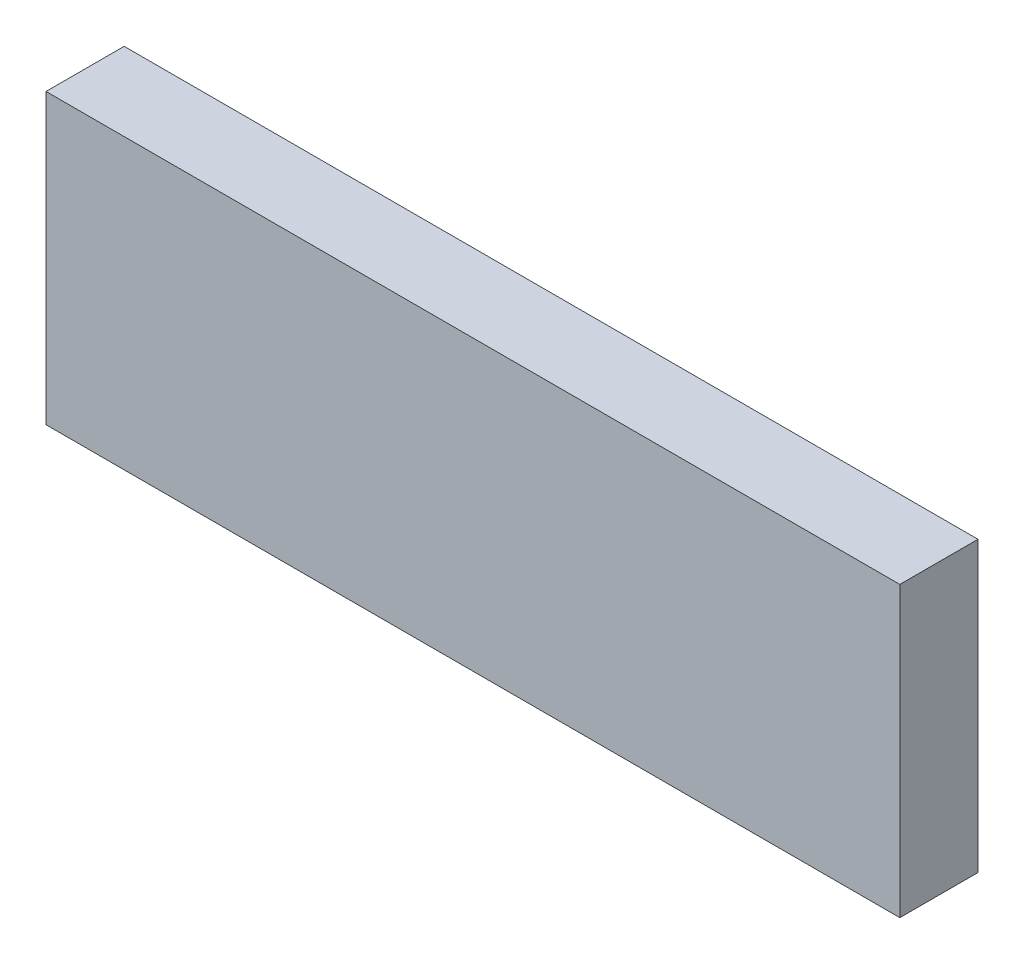
ISO-10303-21;
HEADER;
FILE_DESCRIPTION(('STEP AP214'),'2;1');
FILE_NAME('part.step','',(''),(''),'','','');
FILE_SCHEMA(('AUTOMOTIVE_DESIGN { 1 0 10303 214 1 1 1 1 }'));
ENDSEC;
DATA;
#1=APPLICATION_CONTEXT('core data for automotive mechanical design processes');
#2=APPLICATION_PROTOCOL_DEFINITION('international standard','automotive_design',2000,#1);
#3=PRODUCT_CONTEXT('',#1,'mechanical');
#4=PRODUCT('Part','Part','',(#3));
#5=PRODUCT_RELATED_PRODUCT_CATEGORY('part','',(#4));
#6=PRODUCT_DEFINITION_FORMATION('','',#4);
#7=PRODUCT_DEFINITION_CONTEXT('part definition',#1,'design');
#8=PRODUCT_DEFINITION('design','',#6,#7);
#9=PRODUCT_DEFINITION_SHAPE('','',#8);
#10=(LENGTH_UNIT() NAMED_UNIT(*) SI_UNIT(.MILLI.,.METRE.));
#11=(NAMED_UNIT(*) PLANE_ANGLE_UNIT() SI_UNIT($,.RADIAN.));
#12=(NAMED_UNIT(*) SI_UNIT($,.STERADIAN.) SOLID_ANGLE_UNIT());
#13=UNCERTAINTY_MEASURE_WITH_UNIT(LENGTH_MEASURE(1.E-05),#10,'distance_accuracy_value','');
#14=(GEOMETRIC_REPRESENTATION_CONTEXT(3) GLOBAL_UNCERTAINTY_ASSIGNED_CONTEXT((#13)) GLOBAL_UNIT_ASSIGNED_CONTEXT((#10,
#11,#12)) REPRESENTATION_CONTEXT('',''));
#15=CARTESIAN_POINT('',(0.,0.,0.));
#16=DIRECTION('',(0.,0.,1.));
#17=DIRECTION('',(1.,0.,0.));
#18=AXIS2_PLACEMENT_3D('',#15,#16,#17);
#19=CARTESIAN_POINT('',(0.,0.,13.));
#20=DIRECTION('',(1.,0.,0.));
#21=DIRECTION('',(0.,0.,-1.));
#22=AXIS2_PLACEMENT_3D('',#19,#20,#21);
#23=PLANE('',#22);
#24=DIRECTION('',(0.,-1.,0.));
#25=VECTOR('',#24,1.);
#26=CARTESIAN_POINT('',(0.,0.,0.));
#27=LINE('',#26,#25);
#28=CARTESIAN_POINT('',(0.,48.,0.));
#29=VERTEX_POINT('',#28);
#30=CARTESIAN_POINT('',(0.,0.,0.));
#31=VERTEX_POINT('',#30);
#32=EDGE_CURVE('E94',#29,#31,#27,.T.);
#33=ORIENTED_EDGE('',*,*,#32,.T.);
#34=DIRECTION('',(0.,0.,-1.));
#35=VECTOR('',#34,1.);
#36=CARTESIAN_POINT('',(0.,0.,13.));
#37=LINE('',#36,#35);
#38=CARTESIAN_POINT('',(0.,0.,13.));
#39=VERTEX_POINT('',#38);
#40=EDGE_CURVE('E11',#39,#31,#37,.T.);
#41=ORIENTED_EDGE('',*,*,#40,.F.);
#42=DIRECTION('',(0.,-1.,0.));
#43=VECTOR('',#42,1.);
#44=CARTESIAN_POINT('',(0.,0.,13.));
#45=LINE('',#44,#43);
#46=CARTESIAN_POINT('',(0.,48.,13.));
#47=VERTEX_POINT('',#46);
#48=EDGE_CURVE('E82',#47,#39,#45,.T.);
#49=ORIENTED_EDGE('',*,*,#48,.F.);
#50=DIRECTION('',(0.,0.,-1.));
#51=VECTOR('',#50,1.);
#52=CARTESIAN_POINT('',(0.,48.,13.));
#53=LINE('',#52,#51);
#54=EDGE_CURVE('E90',#47,#29,#53,.T.);
#55=ORIENTED_EDGE('',*,*,#54,.T.);
#56=EDGE_LOOP('',(#33,#41,#49,#55));
#57=FACE_BOUND('',#56,.T.);
#58=ADVANCED_FACE('F31',(#57),#23,.F.);
#59=CARTESIAN_POINT('',(0.,0.,13.));
#60=DIRECTION('',(0.,1.,0.));
#61=DIRECTION('',(0.,0.,1.));
#62=AXIS2_PLACEMENT_3D('',#59,#60,#61);
#63=PLANE('',#62);
#64=DIRECTION('',(1.,0.,0.));
#65=VECTOR('',#64,1.);
#66=CARTESIAN_POINT('',(0.,0.,0.));
#67=LINE('',#66,#65);
#68=CARTESIAN_POINT('',(142.,0.,0.));
#69=VERTEX_POINT('',#68);
#70=EDGE_CURVE('E86',#31,#69,#67,.T.);
#71=ORIENTED_EDGE('',*,*,#70,.T.);
#72=DIRECTION('',(0.,0.,-1.));
#73=VECTOR('',#72,1.);
#74=CARTESIAN_POINT('',(142.,0.,13.));
#75=LINE('',#74,#73);
#76=CARTESIAN_POINT('',(142.,0.,13.));
#77=VERTEX_POINT('',#76);
#78=EDGE_CURVE('E39',#77,#69,#75,.T.);
#79=ORIENTED_EDGE('',*,*,#78,.F.);
#80=DIRECTION('',(1.,0.,0.));
#81=VECTOR('',#80,1.);
#82=CARTESIAN_POINT('',(0.,0.,13.));
#83=LINE('',#82,#81);
#84=EDGE_CURVE('E77',#39,#77,#83,.T.);
#85=ORIENTED_EDGE('',*,*,#84,.F.);
#86=ORIENTED_EDGE('',*,*,#40,.T.);
#87=EDGE_LOOP('',(#71,#79,#85,#86));
#88=FACE_BOUND('',#87,.T.);
#89=ADVANCED_FACE('F85',(#88),#63,.F.);
#90=CARTESIAN_POINT('',(142.,0.,13.));
#91=DIRECTION('',(-1.,0.,0.));
#92=DIRECTION('',(0.,0.,1.));
#93=AXIS2_PLACEMENT_3D('',#90,#91,#92);
#94=PLANE('',#93);
#95=DIRECTION('',(0.,1.,0.));
#96=VECTOR('',#95,1.);
#97=CARTESIAN_POINT('',(142.,0.,0.));
#98=LINE('',#97,#96);
#99=CARTESIAN_POINT('',(142.,48.,0.));
#100=VERTEX_POINT('',#99);
#101=EDGE_CURVE('E64',#69,#100,#98,.T.);
#102=ORIENTED_EDGE('',*,*,#101,.T.);
#103=DIRECTION('',(0.,0.,-1.));
#104=VECTOR('',#103,1.);
#105=CARTESIAN_POINT('',(142.,48.,13.));
#106=LINE('',#105,#104);
#107=CARTESIAN_POINT('',(142.,48.,13.));
#108=VERTEX_POINT('',#107);
#109=EDGE_CURVE('E87',#108,#100,#106,.T.);
#110=ORIENTED_EDGE('',*,*,#109,.F.);
#111=DIRECTION('',(0.,1.,0.));
#112=VECTOR('',#111,1.);
#113=CARTESIAN_POINT('',(142.,0.,13.));
#114=LINE('',#113,#112);
#115=EDGE_CURVE('E80',#77,#108,#114,.T.);
#116=ORIENTED_EDGE('',*,*,#115,.F.);
#117=ORIENTED_EDGE('',*,*,#78,.T.);
#118=EDGE_LOOP('',(#102,#110,#116,#117));
#119=FACE_BOUND('',#118,.T.);
#120=ADVANCED_FACE('F88',(#119),#94,.F.);
#121=CARTESIAN_POINT('',(0.,48.,13.));
#122=DIRECTION('',(0.,-1.,0.));
#123=DIRECTION('',(0.,0.,-1.));
#124=AXIS2_PLACEMENT_3D('',#121,#122,#123);
#125=PLANE('',#124);
#126=DIRECTION('',(-1.,0.,0.));
#127=VECTOR('',#126,1.);
#128=CARTESIAN_POINT('',(0.,48.,0.));
#129=LINE('',#128,#127);
#130=EDGE_CURVE('E70',#100,#29,#129,.T.);
#131=ORIENTED_EDGE('',*,*,#130,.T.);
#132=ORIENTED_EDGE('',*,*,#54,.F.);
#133=DIRECTION('',(-1.,0.,0.));
#134=VECTOR('',#133,1.);
#135=CARTESIAN_POINT('',(0.,48.,13.));
#136=LINE('',#135,#134);
#137=EDGE_CURVE('E47',#108,#47,#136,.T.);
#138=ORIENTED_EDGE('',*,*,#137,.F.);
#139=ORIENTED_EDGE('',*,*,#109,.T.);
#140=EDGE_LOOP('',(#131,#132,#138,#139));
#141=FACE_BOUND('',#140,.T.);
#142=ADVANCED_FACE('F101',(#141),#125,.F.);
#143=CARTESIAN_POINT('',(0.,48.,13.));
#144=DIRECTION('',(0.,0.,-1.));
#145=DIRECTION('',(-1.,0.,0.));
#146=AXIS2_PLACEMENT_3D('',#143,#144,#145);
#147=PLANE('',#146);
#148=ORIENTED_EDGE('',*,*,#48,.T.);
#149=ORIENTED_EDGE('',*,*,#84,.T.);
#150=ORIENTED_EDGE('',*,*,#115,.T.);
#151=ORIENTED_EDGE('',*,*,#137,.T.);
#152=EDGE_LOOP('',(#148,#149,#150,#151));
#153=FACE_BOUND('',#152,.T.);
#154=ADVANCED_FACE('F78',(#153),#147,.F.);
#155=CARTESIAN_POINT('',(0.,48.,0.));
#156=DIRECTION('',(0.,0.,-1.));
#157=DIRECTION('',(-1.,0.,0.));
#158=AXIS2_PLACEMENT_3D('',#155,#156,#157);
#159=PLANE('',#158);
#160=ORIENTED_EDGE('',*,*,#32,.F.);
#161=ORIENTED_EDGE('',*,*,#130,.F.);
#162=ORIENTED_EDGE('',*,*,#101,.F.);
#163=ORIENTED_EDGE('',*,*,#70,.F.);
#164=EDGE_LOOP('',(#160,#161,#162,#163));
#165=FACE_BOUND('',#164,.T.);
#166=ADVANCED_FACE('F104',(#165),#159,.T.);
#167=CLOSED_SHELL('',(#58,#89,#120,#142,#154,#166));
#168=MANIFOLD_SOLID_BREP('B2',#167);
#169=ADVANCED_BREP_SHAPE_REPRESENTATION('',(#18,#168),#14);
#170=SHAPE_DEFINITION_REPRESENTATION(#9,#169);
ENDSEC;
END-ISO-10303-21;
